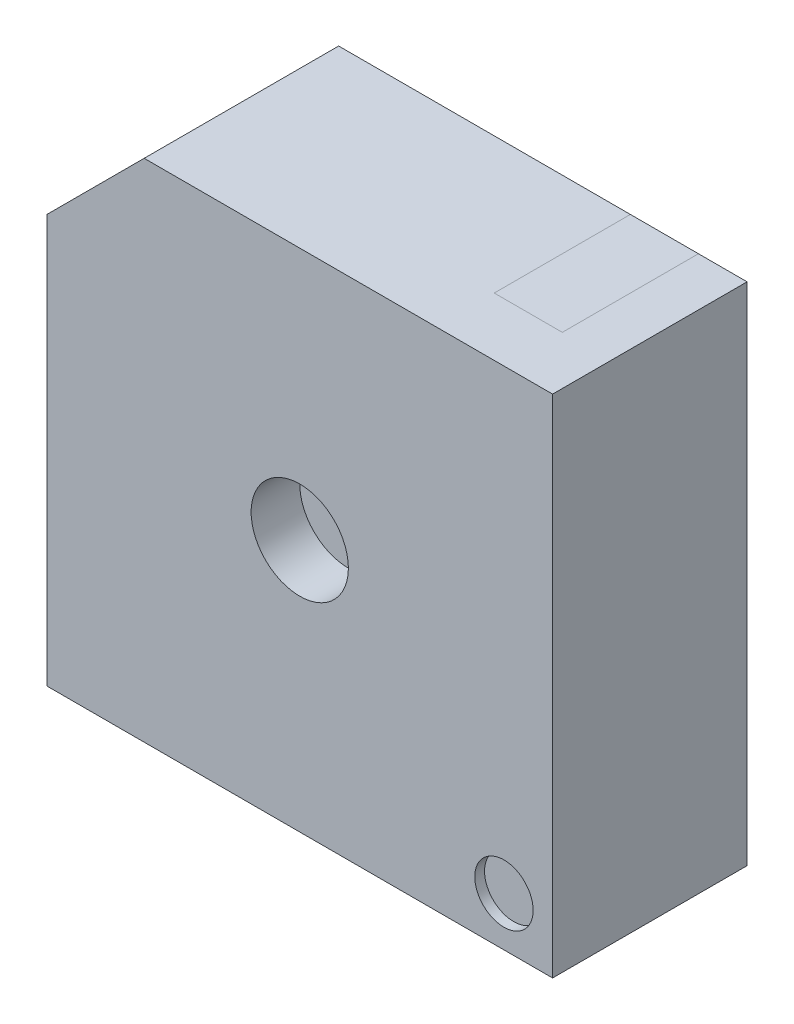
ISO-10303-21;
HEADER;
FILE_DESCRIPTION(('STEP AP214'),'2;1');
FILE_NAME('part.step','',(''),(''),'','','');
FILE_SCHEMA(('AUTOMOTIVE_DESIGN { 1 0 10303 214 1 1 1 1 }'));
ENDSEC;
DATA;
#1=APPLICATION_CONTEXT('core data for automotive mechanical design processes');
#2=APPLICATION_PROTOCOL_DEFINITION('international standard','automotive_design',2000,#1);
#3=PRODUCT_CONTEXT('',#1,'mechanical');
#4=PRODUCT('Part','Part','',(#3));
#5=PRODUCT_RELATED_PRODUCT_CATEGORY('part','',(#4));
#6=PRODUCT_DEFINITION_FORMATION('','',#4);
#7=PRODUCT_DEFINITION_CONTEXT('part definition',#1,'design');
#8=PRODUCT_DEFINITION('design','',#6,#7);
#9=PRODUCT_DEFINITION_SHAPE('','',#8);
#10=(LENGTH_UNIT() NAMED_UNIT(*) SI_UNIT(.MILLI.,.METRE.));
#11=(NAMED_UNIT(*) PLANE_ANGLE_UNIT() SI_UNIT($,.RADIAN.));
#12=(NAMED_UNIT(*) SI_UNIT($,.STERADIAN.) SOLID_ANGLE_UNIT());
#13=UNCERTAINTY_MEASURE_WITH_UNIT(LENGTH_MEASURE(1.E-05),#10,'distance_accuracy_value','');
#14=(GEOMETRIC_REPRESENTATION_CONTEXT(3) GLOBAL_UNCERTAINTY_ASSIGNED_CONTEXT((#13)) GLOBAL_UNIT_ASSIGNED_CONTEXT((#10,
#11,#12)) REPRESENTATION_CONTEXT('',''));
#15=CARTESIAN_POINT('',(0.,0.,0.));
#16=DIRECTION('',(0.,0.,1.));
#17=DIRECTION('',(1.,0.,0.));
#18=AXIS2_PLACEMENT_3D('',#15,#16,#17);
#19=CARTESIAN_POINT('',(-2.6,-2.6,2.));
#20=DIRECTION('',(0.,1.,0.));
#21=DIRECTION('',(-1.,0.,0.));
#22=AXIS2_PLACEMENT_3D('',#19,#20,#21);
#23=PLANE('',#22);
#24=DIRECTION('',(0.,0.,-1.));
#25=VECTOR('',#24,1.);
#26=CARTESIAN_POINT('',(1.4,-2.6,2.));
#27=LINE('',#26,#25);
#28=CARTESIAN_POINT('',(1.4,-2.6,1.4));
#29=VERTEX_POINT('',#28);
#30=CARTESIAN_POINT('',(1.4,-2.6,0.));
#31=VERTEX_POINT('',#30);
#32=EDGE_CURVE('E11',#29,#31,#27,.T.);
#33=ORIENTED_EDGE('',*,*,#32,.F.);
#34=DIRECTION('',(-1.,0.,0.));
#35=VECTOR('',#34,1.);
#36=CARTESIAN_POINT('',(-2.6,-2.6,1.4));
#37=LINE('',#36,#35);
#38=CARTESIAN_POINT('',(2.1,-2.6,1.4));
#39=VERTEX_POINT('',#38);
#40=EDGE_CURVE('E218',#39,#29,#37,.T.);
#41=ORIENTED_EDGE('',*,*,#40,.F.);
#42=DIRECTION('',(0.,0.,1.));
#43=VECTOR('',#42,1.);
#44=CARTESIAN_POINT('',(2.1,-2.6,2.));
#45=LINE('',#44,#43);
#46=CARTESIAN_POINT('',(2.1,-2.6,0.));
#47=VERTEX_POINT('',#46);
#48=EDGE_CURVE('E47',#47,#39,#45,.T.);
#49=ORIENTED_EDGE('',*,*,#48,.F.);
#50=DIRECTION('',(1.,0.,0.));
#51=VECTOR('',#50,1.);
#52=CARTESIAN_POINT('',(-2.6,-2.6,0.));
#53=LINE('',#52,#51);
#54=CARTESIAN_POINT('',(2.6,-2.6,0.));
#55=VERTEX_POINT('',#54);
#56=EDGE_CURVE('E259',#47,#55,#53,.T.);
#57=ORIENTED_EDGE('',*,*,#56,.T.);
#58=DIRECTION('',(0.,0.,-1.));
#59=VECTOR('',#58,1.);
#60=CARTESIAN_POINT('',(2.6,-2.6,2.));
#61=LINE('',#60,#59);
#62=CARTESIAN_POINT('',(2.6,-2.6,2.));
#63=VERTEX_POINT('',#62);
#64=EDGE_CURVE('E304',#63,#55,#61,.T.);
#65=ORIENTED_EDGE('',*,*,#64,.F.);
#66=DIRECTION('',(1.,0.,0.));
#67=VECTOR('',#66,1.);
#68=CARTESIAN_POINT('',(-2.6,-2.6,2.));
#69=LINE('',#68,#67);
#70=CARTESIAN_POINT('',(-2.6,-2.6,2.));
#71=VERTEX_POINT('',#70);
#72=EDGE_CURVE('E154',#71,#63,#69,.T.);
#73=ORIENTED_EDGE('',*,*,#72,.F.);
#74=DIRECTION('',(0.,0.,-1.));
#75=VECTOR('',#74,1.);
#76=CARTESIAN_POINT('',(-2.6,-2.6,2.));
#77=LINE('',#76,#75);
#78=CARTESIAN_POINT('',(-2.6,-2.6,0.));
#79=VERTEX_POINT('',#78);
#80=EDGE_CURVE('E389',#71,#79,#77,.T.);
#81=ORIENTED_EDGE('',*,*,#80,.T.);
#82=CARTESIAN_POINT('',(-2.1,-2.6,0.));
#83=VERTEX_POINT('',#82);
#84=EDGE_CURVE('E158',#79,#83,#53,.T.);
#85=ORIENTED_EDGE('',*,*,#84,.T.);
#86=DIRECTION('',(0.,0.,-1.));
#87=VECTOR('',#86,1.);
#88=CARTESIAN_POINT('',(-2.1,-2.6,2.));
#89=LINE('',#88,#87);
#90=CARTESIAN_POINT('',(-2.1,-2.6,1.4));
#91=VERTEX_POINT('',#90);
#92=EDGE_CURVE('E215',#91,#83,#89,.T.);
#93=ORIENTED_EDGE('',*,*,#92,.F.);
#94=DIRECTION('',(-1.,0.,0.));
#95=VECTOR('',#94,1.);
#96=CARTESIAN_POINT('',(-2.6,-2.6,1.4));
#97=LINE('',#96,#95);
#98=CARTESIAN_POINT('',(-1.4,-2.6,1.4));
#99=VERTEX_POINT('',#98);
#100=EDGE_CURVE('E208',#99,#91,#97,.T.);
#101=ORIENTED_EDGE('',*,*,#100,.F.);
#102=DIRECTION('',(0.,0.,1.));
#103=VECTOR('',#102,1.);
#104=CARTESIAN_POINT('',(-1.4,-2.6,2.));
#105=LINE('',#104,#103);
#106=CARTESIAN_POINT('',(-1.4,-2.6,0.));
#107=VERTEX_POINT('',#106);
#108=EDGE_CURVE('E212',#107,#99,#105,.T.);
#109=ORIENTED_EDGE('',*,*,#108,.F.);
#110=EDGE_CURVE('E271',#107,#31,#53,.T.);
#111=ORIENTED_EDGE('',*,*,#110,.T.);
#112=EDGE_LOOP('',(#33,#41,#49,#57,#65,#73,#81,#85,#93,#101,#109,#111));
#113=FACE_BOUND('',#112,.T.);
#114=ADVANCED_FACE('F38',(#113),#23,.F.);
#115=ORIENTED_EDGE('',*,*,#40,.T.);
#116=ORIENTED_EDGE('',*,*,#32,.T.);
#117=EDGE_CURVE('E263',#31,#47,#53,.T.);
#118=ORIENTED_EDGE('',*,*,#117,.T.);
#119=ORIENTED_EDGE('',*,*,#48,.T.);
#120=EDGE_LOOP('',(#115,#116,#118,#119));
#121=FACE_BOUND('',#120,.T.);
#122=ADVANCED_FACE('F257',(#121),#23,.F.);
#123=CARTESIAN_POINT('',(-1.6,2.6,2.));
#124=DIRECTION('',(0.,-1.,0.));
#125=DIRECTION('',(1.,0.,0.));
#126=AXIS2_PLACEMENT_3D('',#123,#124,#125);
#127=PLANE('',#126);
#128=DIRECTION('',(0.,0.,1.));
#129=VECTOR('',#128,1.);
#130=CARTESIAN_POINT('',(1.4,2.6,2.));
#131=LINE('',#130,#129);
#132=CARTESIAN_POINT('',(1.4,2.6,0.));
#133=VERTEX_POINT('',#132);
#134=CARTESIAN_POINT('',(1.4,2.6,1.4));
#135=VERTEX_POINT('',#134);
#136=EDGE_CURVE('E205',#133,#135,#131,.T.);
#137=ORIENTED_EDGE('',*,*,#136,.F.);
#138=DIRECTION('',(-1.,0.,0.));
#139=VECTOR('',#138,1.);
#140=CARTESIAN_POINT('',(-1.6,2.6,0.));
#141=LINE('',#140,#139);
#142=CARTESIAN_POINT('',(-1.6,2.6,0.));
#143=VERTEX_POINT('',#142);
#144=EDGE_CURVE('E300',#133,#143,#141,.T.);
#145=ORIENTED_EDGE('',*,*,#144,.T.);
#146=DIRECTION('',(0.,0.,-1.));
#147=VECTOR('',#146,1.);
#148=CARTESIAN_POINT('',(-1.6,2.6,2.));
#149=LINE('',#148,#147);
#150=CARTESIAN_POINT('',(-1.6,2.6,2.));
#151=VERTEX_POINT('',#150);
#152=EDGE_CURVE('E145',#151,#143,#149,.T.);
#153=ORIENTED_EDGE('',*,*,#152,.F.);
#154=DIRECTION('',(-1.,0.,0.));
#155=VECTOR('',#154,1.);
#156=CARTESIAN_POINT('',(-1.6,2.6,2.));
#157=LINE('',#156,#155);
#158=CARTESIAN_POINT('',(2.6,2.6,2.));
#159=VERTEX_POINT('',#158);
#160=EDGE_CURVE('E137',#159,#151,#157,.T.);
#161=ORIENTED_EDGE('',*,*,#160,.F.);
#162=DIRECTION('',(0.,0.,-1.));
#163=VECTOR('',#162,1.);
#164=CARTESIAN_POINT('',(2.6,2.6,2.));
#165=LINE('',#164,#163);
#166=CARTESIAN_POINT('',(2.6,2.6,0.));
#167=VERTEX_POINT('',#166);
#168=EDGE_CURVE('E142',#159,#167,#165,.T.);
#169=ORIENTED_EDGE('',*,*,#168,.T.);
#170=CARTESIAN_POINT('',(2.1,2.6,0.));
#171=VERTEX_POINT('',#170);
#172=EDGE_CURVE('E295',#167,#171,#141,.T.);
#173=ORIENTED_EDGE('',*,*,#172,.T.);
#174=DIRECTION('',(0.,0.,-1.));
#175=VECTOR('',#174,1.);
#176=CARTESIAN_POINT('',(2.1,2.6,2.));
#177=LINE('',#176,#175);
#178=CARTESIAN_POINT('',(2.1,2.6,1.4));
#179=VERTEX_POINT('',#178);
#180=EDGE_CURVE('E199',#179,#171,#177,.T.);
#181=ORIENTED_EDGE('',*,*,#180,.F.);
#182=DIRECTION('',(1.,0.,0.));
#183=VECTOR('',#182,1.);
#184=CARTESIAN_POINT('',(-1.6,2.6,1.4));
#185=LINE('',#184,#183);
#186=EDGE_CURVE('E202',#135,#179,#185,.T.);
#187=ORIENTED_EDGE('',*,*,#186,.F.);
#188=EDGE_LOOP('',(#137,#145,#153,#161,#169,#173,#181,#187));
#189=FACE_BOUND('',#188,.T.);
#190=ADVANCED_FACE('F139',(#189),#127,.F.);
#191=CARTESIAN_POINT('',(0.,0.,0.));
#192=DIRECTION('',(0.,0.,1.));
#193=DIRECTION('',(1.,0.,0.));
#194=AXIS2_PLACEMENT_3D('',#191,#192,#193);
#195=PLANE('',#194);
#196=DIRECTION('',(0.,-1.,0.));
#197=VECTOR('',#196,1.);
#198=CARTESIAN_POINT('',(2.1,0.,0.));
#199=LINE('',#198,#197);
#200=CARTESIAN_POINT('',(2.1,1.7,0.));
#201=VERTEX_POINT('',#200);
#202=EDGE_CURVE('E196',#171,#201,#199,.T.);
#203=ORIENTED_EDGE('',*,*,#202,.F.);
#204=ORIENTED_EDGE('',*,*,#172,.F.);
#205=DIRECTION('',(0.,1.,0.));
#206=VECTOR('',#205,1.);
#207=CARTESIAN_POINT('',(2.6,2.6,0.));
#208=LINE('',#207,#206);
#209=EDGE_CURVE('E161',#55,#167,#208,.T.);
#210=ORIENTED_EDGE('',*,*,#209,.F.);
#211=ORIENTED_EDGE('',*,*,#56,.F.);
#212=DIRECTION('',(0.,-1.,0.));
#213=VECTOR('',#212,1.);
#214=CARTESIAN_POINT('',(2.1,0.,0.));
#215=LINE('',#214,#213);
#216=CARTESIAN_POINT('',(2.1,-1.7,0.));
#217=VERTEX_POINT('',#216);
#218=EDGE_CURVE('E174',#217,#47,#215,.T.);
#219=ORIENTED_EDGE('',*,*,#218,.F.);
#220=DIRECTION('',(1.,0.,0.));
#221=VECTOR('',#220,1.);
#222=CARTESIAN_POINT('',(0.,-1.7,0.));
#223=LINE('',#222,#221);
#224=CARTESIAN_POINT('',(1.4,-1.7,0.));
#225=VERTEX_POINT('',#224);
#226=EDGE_CURVE('E162',#225,#217,#223,.T.);
#227=ORIENTED_EDGE('',*,*,#226,.F.);
#228=DIRECTION('',(0.,1.,0.));
#229=VECTOR('',#228,1.);
#230=CARTESIAN_POINT('',(1.4,0.,0.));
#231=LINE('',#230,#229);
#232=EDGE_CURVE('E166',#31,#225,#231,.T.);
#233=ORIENTED_EDGE('',*,*,#232,.F.);
#234=ORIENTED_EDGE('',*,*,#110,.F.);
#235=DIRECTION('',(0.,-1.,0.));
#236=VECTOR('',#235,1.);
#237=CARTESIAN_POINT('',(-1.4,0.,0.));
#238=LINE('',#237,#236);
#239=CARTESIAN_POINT('',(-1.4,-1.7,0.));
#240=VERTEX_POINT('',#239);
#241=EDGE_CURVE('E185',#240,#107,#238,.T.);
#242=ORIENTED_EDGE('',*,*,#241,.F.);
#243=DIRECTION('',(1.,0.,0.));
#244=VECTOR('',#243,1.);
#245=CARTESIAN_POINT('',(0.,-1.7,0.));
#246=LINE('',#245,#244);
#247=CARTESIAN_POINT('',(-2.1,-1.7,0.));
#248=VERTEX_POINT('',#247);
#249=EDGE_CURVE('E178',#248,#240,#246,.T.);
#250=ORIENTED_EDGE('',*,*,#249,.F.);
#251=DIRECTION('',(0.,1.,0.));
#252=VECTOR('',#251,1.);
#253=CARTESIAN_POINT('',(-2.1,0.,0.));
#254=LINE('',#253,#252);
#255=EDGE_CURVE('E182',#83,#248,#254,.T.);
#256=ORIENTED_EDGE('',*,*,#255,.F.);
#257=ORIENTED_EDGE('',*,*,#84,.F.);
#258=DIRECTION('',(0.,-1.,0.));
#259=VECTOR('',#258,1.);
#260=CARTESIAN_POINT('',(-2.6,1.6,0.));
#261=LINE('',#260,#259);
#262=CARTESIAN_POINT('',(-2.6,1.6,0.));
#263=VERTEX_POINT('',#262);
#264=EDGE_CURVE('E268',#263,#79,#261,.T.);
#265=ORIENTED_EDGE('',*,*,#264,.F.);
#266=DIRECTION('',(-0.707106781186546,-0.707106781186549,0.));
#267=VECTOR('',#266,1.);
#268=CARTESIAN_POINT('',(-2.6,1.6,0.));
#269=LINE('',#268,#267);
#270=EDGE_CURVE('E291',#143,#263,#269,.T.);
#271=ORIENTED_EDGE('',*,*,#270,.F.);
#272=ORIENTED_EDGE('',*,*,#144,.F.);
#273=DIRECTION('',(0.,1.,0.));
#274=VECTOR('',#273,1.);
#275=CARTESIAN_POINT('',(1.4,0.,0.));
#276=LINE('',#275,#274);
#277=CARTESIAN_POINT('',(1.4,1.7,0.));
#278=VERTEX_POINT('',#277);
#279=EDGE_CURVE('E189',#278,#133,#276,.T.);
#280=ORIENTED_EDGE('',*,*,#279,.F.);
#281=DIRECTION('',(-1.,0.,0.));
#282=VECTOR('',#281,1.);
#283=CARTESIAN_POINT('',(0.,1.7,0.));
#284=LINE('',#283,#282);
#285=EDGE_CURVE('E193',#201,#278,#284,.T.);
#286=ORIENTED_EDGE('',*,*,#285,.F.);
#287=EDGE_LOOP('',(#203,#204,#210,#211,#219,#227,#233,#234,#242,#250,#256,#257,#265,#271,#272,
#280,#286));
#288=FACE_BOUND('',#287,.T.);
#289=ADVANCED_FACE('F267',(#288),#195,.F.);
#290=EDGE_CURVE('E299',#171,#133,#141,.T.);
#291=ORIENTED_EDGE('',*,*,#290,.F.);
#292=ORIENTED_EDGE('',*,*,#202,.T.);
#293=ORIENTED_EDGE('',*,*,#285,.T.);
#294=ORIENTED_EDGE('',*,*,#279,.T.);
#295=EDGE_LOOP('',(#291,#292,#293,#294));
#296=FACE_BOUND('',#295,.T.);
#297=ADVANCED_FACE('F374',(#296),#195,.F.);
#298=ORIENTED_EDGE('',*,*,#249,.T.);
#299=ORIENTED_EDGE('',*,*,#241,.T.);
#300=EDGE_CURVE('E270',#83,#107,#53,.T.);
#301=ORIENTED_EDGE('',*,*,#300,.F.);
#302=ORIENTED_EDGE('',*,*,#255,.T.);
#303=EDGE_LOOP('',(#298,#299,#301,#302));
#304=FACE_BOUND('',#303,.T.);
#305=ADVANCED_FACE('F284',(#304),#195,.F.);
#306=CARTESIAN_POINT('',(2.6,2.6,2.));
#307=DIRECTION('',(-1.,0.,0.));
#308=DIRECTION('',(0.,-1.,0.));
#309=AXIS2_PLACEMENT_3D('',#306,#307,#308);
#310=PLANE('',#309);
#311=ORIENTED_EDGE('',*,*,#209,.T.);
#312=ORIENTED_EDGE('',*,*,#168,.F.);
#313=DIRECTION('',(0.,1.,0.));
#314=VECTOR('',#313,1.);
#315=CARTESIAN_POINT('',(2.6,2.6,2.));
#316=LINE('',#315,#314);
#317=EDGE_CURVE('E149',#63,#159,#316,.T.);
#318=ORIENTED_EDGE('',*,*,#317,.F.);
#319=ORIENTED_EDGE('',*,*,#64,.T.);
#320=EDGE_LOOP('',(#311,#312,#318,#319));
#321=FACE_BOUND('',#320,.T.);
#322=ADVANCED_FACE('F40',(#321),#310,.F.);
#323=ORIENTED_EDGE('',*,*,#290,.T.);
#324=ORIENTED_EDGE('',*,*,#136,.T.);
#325=ORIENTED_EDGE('',*,*,#186,.T.);
#326=ORIENTED_EDGE('',*,*,#180,.T.);
#327=EDGE_LOOP('',(#323,#324,#325,#326));
#328=FACE_BOUND('',#327,.T.);
#329=ADVANCED_FACE('F361',(#328),#127,.F.);
#330=CARTESIAN_POINT('',(-2.6,1.6,2.));
#331=DIRECTION('',(0.707106781186549,-0.707106781186546,0.));
#332=DIRECTION('',(0.707106781186546,0.707106781186549,0.));
#333=AXIS2_PLACEMENT_3D('',#330,#331,#332);
#334=PLANE('',#333);
#335=ORIENTED_EDGE('',*,*,#270,.T.);
#336=DIRECTION('',(0.,0.,-1.));
#337=VECTOR('',#336,1.);
#338=CARTESIAN_POINT('',(-2.6,1.6,2.));
#339=LINE('',#338,#337);
#340=CARTESIAN_POINT('',(-2.6,1.6,2.));
#341=VERTEX_POINT('',#340);
#342=EDGE_CURVE('E168',#341,#263,#339,.T.);
#343=ORIENTED_EDGE('',*,*,#342,.F.);
#344=DIRECTION('',(-0.707106781186546,-0.707106781186549,0.));
#345=VECTOR('',#344,1.);
#346=CARTESIAN_POINT('',(-2.6,1.6,2.));
#347=LINE('',#346,#345);
#348=EDGE_CURVE('E148',#151,#341,#347,.T.);
#349=ORIENTED_EDGE('',*,*,#348,.F.);
#350=ORIENTED_EDGE('',*,*,#152,.T.);
#351=EDGE_LOOP('',(#335,#343,#349,#350));
#352=FACE_BOUND('',#351,.T.);
#353=ADVANCED_FACE('F357',(#352),#334,.F.);
#354=CARTESIAN_POINT('',(-2.6,1.6,2.));
#355=DIRECTION('',(1.,0.,0.));
#356=DIRECTION('',(0.,1.,0.));
#357=AXIS2_PLACEMENT_3D('',#354,#355,#356);
#358=PLANE('',#357);
#359=ORIENTED_EDGE('',*,*,#264,.T.);
#360=ORIENTED_EDGE('',*,*,#80,.F.);
#361=DIRECTION('',(0.,-1.,0.));
#362=VECTOR('',#361,1.);
#363=CARTESIAN_POINT('',(-2.6,1.6,2.));
#364=LINE('',#363,#362);
#365=EDGE_CURVE('E305',#341,#71,#364,.T.);
#366=ORIENTED_EDGE('',*,*,#365,.F.);
#367=ORIENTED_EDGE('',*,*,#342,.T.);
#368=EDGE_LOOP('',(#359,#360,#366,#367));
#369=FACE_BOUND('',#368,.T.);
#370=ADVANCED_FACE('F353',(#369),#358,.F.);
#371=ORIENTED_EDGE('',*,*,#100,.T.);
#372=ORIENTED_EDGE('',*,*,#92,.T.);
#373=ORIENTED_EDGE('',*,*,#300,.T.);
#374=ORIENTED_EDGE('',*,*,#108,.T.);
#375=EDGE_LOOP('',(#371,#372,#373,#374));
#376=FACE_BOUND('',#375,.T.);
#377=ADVANCED_FACE('F280',(#376),#23,.F.);
#378=CARTESIAN_POINT('',(0.,0.,2.));
#379=DIRECTION('',(0.,0.,1.));
#380=DIRECTION('',(1.,0.,0.));
#381=AXIS2_PLACEMENT_3D('',#378,#379,#380);
#382=PLANE('',#381);
#383=CARTESIAN_POINT('',(2.1,-2.0980098825876,2.));
#384=DIRECTION('',(0.,0.,1.));
#385=DIRECTION('',(1.,0.,0.));
#386=AXIS2_PLACEMENT_3D('',#383,#384,#385);
#387=CIRCLE('',#386,0.3);
#388=CARTESIAN_POINT('',(2.4,-2.0980098825876,2.));
#389=VERTEX_POINT('',#388);
#390=EDGE_CURVE('E314',#389,#389,#387,.T.);
#391=ORIENTED_EDGE('',*,*,#390,.F.);
#392=EDGE_LOOP('',(#391));
#393=FACE_BOUND('',#392,.T.);
#394=CARTESIAN_POINT('',(0.,0.,2.));
#395=DIRECTION('',(0.,0.,1.));
#396=DIRECTION('',(1.,0.,0.));
#397=AXIS2_PLACEMENT_3D('',#394,#395,#396);
#398=CIRCLE('',#397,0.5);
#399=CARTESIAN_POINT('',(0.5,0.,2.));
#400=VERTEX_POINT('',#399);
#401=EDGE_CURVE('E308',#400,#400,#398,.T.);
#402=ORIENTED_EDGE('',*,*,#401,.F.);
#403=EDGE_LOOP('',(#402));
#404=FACE_BOUND('',#403,.T.);
#405=ORIENTED_EDGE('',*,*,#317,.T.);
#406=ORIENTED_EDGE('',*,*,#160,.T.);
#407=ORIENTED_EDGE('',*,*,#348,.T.);
#408=ORIENTED_EDGE('',*,*,#365,.T.);
#409=ORIENTED_EDGE('',*,*,#72,.T.);
#410=EDGE_LOOP('',(#405,#406,#407,#408,#409));
#411=FACE_BOUND('',#410,.T.);
#412=ADVANCED_FACE('F152',(#393,#404,#411),#382,.T.);
#413=ORIENTED_EDGE('',*,*,#226,.T.);
#414=ORIENTED_EDGE('',*,*,#218,.T.);
#415=ORIENTED_EDGE('',*,*,#117,.F.);
#416=ORIENTED_EDGE('',*,*,#232,.T.);
#417=EDGE_LOOP('',(#413,#414,#415,#416));
#418=FACE_BOUND('',#417,.T.);
#419=ADVANCED_FACE('F262',(#418),#195,.F.);
#420=CARTESIAN_POINT('',(0.,0.,1.5));
#421=DIRECTION('',(0.,0.,1.));
#422=DIRECTION('',(1.,0.,0.));
#423=AXIS2_PLACEMENT_3D('',#420,#421,#422);
#424=CYLINDRICAL_SURFACE('',#423,0.5);
#425=CARTESIAN_POINT('',(0.,0.,1.5));
#426=DIRECTION('',(0.,0.,1.));
#427=DIRECTION('',(1.,0.,0.));
#428=AXIS2_PLACEMENT_3D('',#425,#426,#427);
#429=CIRCLE('',#428,0.5);
#430=CARTESIAN_POINT('',(0.5,0.,1.5));
#431=VERTEX_POINT('',#430);
#432=EDGE_CURVE('E302',#431,#431,#429,.T.);
#433=ORIENTED_EDGE('',*,*,#432,.F.);
#434=EDGE_LOOP('',(#433));
#435=FACE_BOUND('',#434,.T.);
#436=ORIENTED_EDGE('',*,*,#401,.T.);
#437=EDGE_LOOP('',(#436));
#438=FACE_BOUND('',#437,.T.);
#439=ADVANCED_FACE('F334',(#435,#438),#424,.F.);
#440=CARTESIAN_POINT('',(0.,0.,1.5));
#441=DIRECTION('',(0.,0.,1.));
#442=DIRECTION('',(1.,0.,0.));
#443=AXIS2_PLACEMENT_3D('',#440,#441,#442);
#444=PLANE('',#443);
#445=ORIENTED_EDGE('',*,*,#432,.T.);
#446=EDGE_LOOP('',(#445));
#447=FACE_BOUND('',#446,.T.);
#448=ADVANCED_FACE('F325',(#447),#444,.T.);
#449=CARTESIAN_POINT('',(2.1,-2.0980098825876,1.9));
#450=DIRECTION('',(0.,0.,1.));
#451=DIRECTION('',(1.,0.,0.));
#452=AXIS2_PLACEMENT_3D('',#449,#450,#451);
#453=CYLINDRICAL_SURFACE('',#452,0.3);
#454=CARTESIAN_POINT('',(2.1,-2.0980098825876,1.9));
#455=DIRECTION('',(0.,0.,1.));
#456=DIRECTION('',(1.,0.,0.));
#457=AXIS2_PLACEMENT_3D('',#454,#455,#456);
#458=CIRCLE('',#457,0.3);
#459=CARTESIAN_POINT('',(2.4,-2.0980098825876,1.9));
#460=VERTEX_POINT('',#459);
#461=EDGE_CURVE('E311',#460,#460,#458,.T.);
#462=ORIENTED_EDGE('',*,*,#461,.F.);
#463=EDGE_LOOP('',(#462));
#464=FACE_BOUND('',#463,.T.);
#465=ORIENTED_EDGE('',*,*,#390,.T.);
#466=EDGE_LOOP('',(#465));
#467=FACE_BOUND('',#466,.T.);
#468=ADVANCED_FACE('F322',(#464,#467),#453,.F.);
#469=CARTESIAN_POINT('',(0.,0.,1.9));
#470=DIRECTION('',(0.,0.,1.));
#471=DIRECTION('',(1.,0.,0.));
#472=AXIS2_PLACEMENT_3D('',#469,#470,#471);
#473=PLANE('',#472);
#474=ORIENTED_EDGE('',*,*,#461,.T.);
#475=EDGE_LOOP('',(#474));
#476=FACE_BOUND('',#475,.T.);
#477=ADVANCED_FACE('F320',(#476),#473,.T.);
#478=CLOSED_SHELL('',(#114,#122,#190,#289,#297,#305,#322,#329,#353,#370,#377,#412,#419,#439,
#448,#468,#477));
#479=MANIFOLD_SOLID_BREP('B2',#478);
#480=ADVANCED_BREP_SHAPE_REPRESENTATION('',(#18,#479),#14);
#481=SHAPE_DEFINITION_REPRESENTATION(#9,#480);
ENDSEC;
END-ISO-10303-21;
